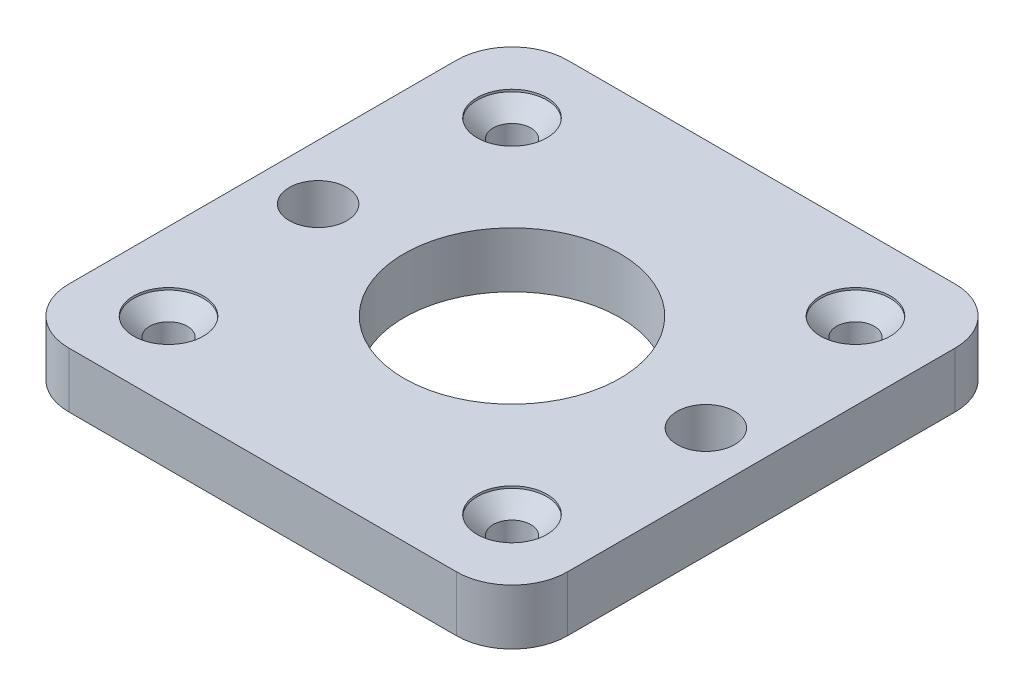
ISO-10303-21;
HEADER;
FILE_DESCRIPTION(('STEP AP214'),'2;1');
FILE_NAME('part.step','',(''),(''),'','','');
FILE_SCHEMA(('AUTOMOTIVE_DESIGN { 1 0 10303 214 1 1 1 1 }'));
ENDSEC;
DATA;
#1=APPLICATION_CONTEXT('core data for automotive mechanical design processes');
#2=APPLICATION_PROTOCOL_DEFINITION('international standard','automotive_design',2000,#1);
#3=PRODUCT_CONTEXT('',#1,'mechanical');
#4=PRODUCT('Part','Part','',(#3));
#5=PRODUCT_RELATED_PRODUCT_CATEGORY('part','',(#4));
#6=PRODUCT_DEFINITION_FORMATION('','',#4);
#7=PRODUCT_DEFINITION_CONTEXT('part definition',#1,'design');
#8=PRODUCT_DEFINITION('design','',#6,#7);
#9=PRODUCT_DEFINITION_SHAPE('','',#8);
#10=(LENGTH_UNIT() NAMED_UNIT(*) SI_UNIT(.MILLI.,.METRE.));
#11=(NAMED_UNIT(*) PLANE_ANGLE_UNIT() SI_UNIT($,.RADIAN.));
#12=(NAMED_UNIT(*) SI_UNIT($,.STERADIAN.) SOLID_ANGLE_UNIT());
#13=UNCERTAINTY_MEASURE_WITH_UNIT(LENGTH_MEASURE(1.E-05),#10,'distance_accuracy_value','');
#14=(GEOMETRIC_REPRESENTATION_CONTEXT(3) GLOBAL_UNCERTAINTY_ASSIGNED_CONTEXT((#13)) GLOBAL_UNIT_ASSIGNED_CONTEXT((#10,
#11,#12)) REPRESENTATION_CONTEXT('',''));
#15=CARTESIAN_POINT('',(0.,0.,0.));
#16=DIRECTION('',(0.,0.,1.));
#17=DIRECTION('',(1.,0.,0.));
#18=AXIS2_PLACEMENT_3D('',#15,#16,#17);
#19=CARTESIAN_POINT('',(0.,-2.5,0.));
#20=DIRECTION('',(0.,1.,0.));
#21=DIRECTION('',(0.,0.,1.));
#22=AXIS2_PLACEMENT_3D('',#19,#20,#21);
#23=PLANE('',#22);
#24=CARTESIAN_POINT('',(0.,-2.5,0.));
#25=DIRECTION('',(0.,1.,0.));
#26=DIRECTION('',(0.,0.,1.));
#27=AXIS2_PLACEMENT_3D('',#24,#25,#26);
#28=CIRCLE('',#27,9.75);
#29=CARTESIAN_POINT('',(0.,-2.5,9.75000000000001));
#30=VERTEX_POINT('',#29);
#31=EDGE_CURVE('E133',#30,#30,#28,.T.);
#32=ORIENTED_EDGE('',*,*,#31,.T.);
#33=EDGE_LOOP('',(#32));
#34=FACE_BOUND('',#33,.T.);
#35=DIRECTION('',(0.,0.,-1.));
#36=VECTOR('',#35,1.);
#37=CARTESIAN_POINT('',(22.5,-2.5,-22.5));
#38=LINE('',#37,#36);
#39=CARTESIAN_POINT('',(22.5,-2.5,17.5));
#40=VERTEX_POINT('',#39);
#41=CARTESIAN_POINT('',(22.5,-2.5,-17.5));
#42=VERTEX_POINT('',#41);
#43=EDGE_CURVE('E117',#40,#42,#38,.T.);
#44=ORIENTED_EDGE('',*,*,#43,.F.);
#45=CARTESIAN_POINT('',(17.5,-2.5,17.5));
#46=DIRECTION('',(0.,1.,0.));
#47=DIRECTION('',(0.,0.,1.));
#48=AXIS2_PLACEMENT_3D('',#45,#46,#47);
#49=CIRCLE('',#48,5.);
#50=CARTESIAN_POINT('',(17.5,-2.5,22.5));
#51=VERTEX_POINT('',#50);
#52=EDGE_CURVE('E100',#40,#51,#49,.F.);
#53=ORIENTED_EDGE('',*,*,#52,.T.);
#54=DIRECTION('',(1.,0.,0.));
#55=VECTOR('',#54,1.);
#56=CARTESIAN_POINT('',(-22.5,-2.5,22.5));
#57=LINE('',#56,#55);
#58=CARTESIAN_POINT('',(-17.5,-2.5,22.5));
#59=VERTEX_POINT('',#58);
#60=EDGE_CURVE('E140',#59,#51,#57,.T.);
#61=ORIENTED_EDGE('',*,*,#60,.F.);
#62=CARTESIAN_POINT('',(-17.5,-2.5,17.5));
#63=DIRECTION('',(0.,1.,0.));
#64=DIRECTION('',(0.,0.,1.));
#65=AXIS2_PLACEMENT_3D('',#62,#63,#64);
#66=CIRCLE('',#65,5.);
#67=CARTESIAN_POINT('',(-22.5,-2.5,17.5));
#68=VERTEX_POINT('',#67);
#69=EDGE_CURVE('E111',#59,#68,#66,.F.);
#70=ORIENTED_EDGE('',*,*,#69,.T.);
#71=DIRECTION('',(0.,0.,1.));
#72=VECTOR('',#71,1.);
#73=CARTESIAN_POINT('',(-22.5,-2.5,-22.5));
#74=LINE('',#73,#72);
#75=CARTESIAN_POINT('',(-22.5,-2.5,-17.5));
#76=VERTEX_POINT('',#75);
#77=EDGE_CURVE('E130',#76,#68,#74,.T.);
#78=ORIENTED_EDGE('',*,*,#77,.F.);
#79=CARTESIAN_POINT('',(-17.5,-2.5,-17.5));
#80=DIRECTION('',(0.,1.,0.));
#81=DIRECTION('',(0.,0.,1.));
#82=AXIS2_PLACEMENT_3D('',#79,#80,#81);
#83=CIRCLE('',#82,5.);
#84=CARTESIAN_POINT('',(-17.5,-2.5,-22.5));
#85=VERTEX_POINT('',#84);
#86=EDGE_CURVE('E144',#76,#85,#83,.F.);
#87=ORIENTED_EDGE('',*,*,#86,.T.);
#88=DIRECTION('',(-1.,0.,0.));
#89=VECTOR('',#88,1.);
#90=CARTESIAN_POINT('',(-22.5,-2.5,-22.5));
#91=LINE('',#90,#89);
#92=CARTESIAN_POINT('',(17.5,-2.5,-22.5));
#93=VERTEX_POINT('',#92);
#94=EDGE_CURVE('E126',#93,#85,#91,.T.);
#95=ORIENTED_EDGE('',*,*,#94,.F.);
#96=CARTESIAN_POINT('',(17.5,-2.5,-17.5));
#97=DIRECTION('',(0.,1.,0.));
#98=DIRECTION('',(0.,0.,1.));
#99=AXIS2_PLACEMENT_3D('',#96,#97,#98);
#100=CIRCLE('',#99,5.);
#101=EDGE_CURVE('E121',#93,#42,#100,.F.);
#102=ORIENTED_EDGE('',*,*,#101,.T.);
#103=EDGE_LOOP('',(#44,#53,#61,#70,#78,#87,#95,#102));
#104=FACE_BOUND('',#103,.T.);
#105=CARTESIAN_POINT('',(-15.5,-2.5,15.5000000000002));
#106=DIRECTION('',(0.,1.,0.));
#107=DIRECTION('',(0.,0.,1.));
#108=AXIS2_PLACEMENT_3D('',#105,#106,#107);
#109=CIRCLE('',#108,1.725);
#110=CARTESIAN_POINT('',(-15.5,-2.5,17.2250000000002));
#111=VERTEX_POINT('',#110);
#112=EDGE_CURVE('E194',#111,#111,#109,.T.);
#113=ORIENTED_EDGE('',*,*,#112,.T.);
#114=EDGE_LOOP('',(#113));
#115=FACE_BOUND('',#114,.T.);
#116=CARTESIAN_POINT('',(15.5,-2.5,15.5000000000002));
#117=DIRECTION('',(0.,1.,0.));
#118=DIRECTION('',(0.,0.,1.));
#119=AXIS2_PLACEMENT_3D('',#116,#117,#118);
#120=CIRCLE('',#119,1.725);
#121=CARTESIAN_POINT('',(15.5,-2.5,17.2250000000002));
#122=VERTEX_POINT('',#121);
#123=EDGE_CURVE('E209',#122,#122,#120,.T.);
#124=ORIENTED_EDGE('',*,*,#123,.T.);
#125=EDGE_LOOP('',(#124));
#126=FACE_BOUND('',#125,.T.);
#127=CARTESIAN_POINT('',(15.5,-2.5,-15.5000000000001));
#128=DIRECTION('',(0.,1.,0.));
#129=DIRECTION('',(0.,0.,1.));
#130=AXIS2_PLACEMENT_3D('',#127,#128,#129);
#131=CIRCLE('',#130,1.725);
#132=CARTESIAN_POINT('',(15.5,-2.5,-13.7750000000001));
#133=VERTEX_POINT('',#132);
#134=EDGE_CURVE('E224',#133,#133,#131,.T.);
#135=ORIENTED_EDGE('',*,*,#134,.T.);
#136=EDGE_LOOP('',(#135));
#137=FACE_BOUND('',#136,.T.);
#138=CARTESIAN_POINT('',(-15.5,-2.5,-15.5000000000001));
#139=DIRECTION('',(0.,1.,0.));
#140=DIRECTION('',(0.,0.,1.));
#141=AXIS2_PLACEMENT_3D('',#138,#139,#140);
#142=CIRCLE('',#141,1.725);
#143=CARTESIAN_POINT('',(-15.5,-2.5,-13.7750000000001));
#144=VERTEX_POINT('',#143);
#145=EDGE_CURVE('E239',#144,#144,#142,.T.);
#146=ORIENTED_EDGE('',*,*,#145,.T.);
#147=EDGE_LOOP('',(#146));
#148=FACE_BOUND('',#147,.T.);
#149=CARTESIAN_POINT('',(17.5,-2.5,0.));
#150=DIRECTION('',(0.,-1.,0.));
#151=DIRECTION('',(0.,0.,-1.));
#152=AXIS2_PLACEMENT_3D('',#149,#150,#151);
#153=CIRCLE('',#152,2.59999999999999);
#154=CARTESIAN_POINT('',(17.5,-2.5,-2.59999999999999));
#155=VERTEX_POINT('',#154);
#156=EDGE_CURVE('E245',#155,#155,#153,.T.);
#157=ORIENTED_EDGE('',*,*,#156,.F.);
#158=EDGE_LOOP('',(#157));
#159=FACE_BOUND('',#158,.T.);
#160=CARTESIAN_POINT('',(-17.5,-2.5,0.));
#161=DIRECTION('',(0.,-1.,0.));
#162=DIRECTION('',(0.,0.,-1.));
#163=AXIS2_PLACEMENT_3D('',#160,#161,#162);
#164=CIRCLE('',#163,2.59999999999999);
#165=CARTESIAN_POINT('',(-17.5,-2.5,-2.59999999999999));
#166=VERTEX_POINT('',#165);
#167=EDGE_CURVE('E251',#166,#166,#164,.T.);
#168=ORIENTED_EDGE('',*,*,#167,.F.);
#169=EDGE_LOOP('',(#168));
#170=FACE_BOUND('',#169,.T.);
#171=ADVANCED_FACE('F34',(#34,#104,#115,#126,#137,#148,#159,#170),#23,.F.);
#172=CARTESIAN_POINT('',(0.,2.5,0.));
#173=DIRECTION('',(0.,1.,0.));
#174=DIRECTION('',(0.,0.,1.));
#175=AXIS2_PLACEMENT_3D('',#172,#173,#174);
#176=PLANE('',#175);
#177=CARTESIAN_POINT('',(-17.5,2.5,0.));
#178=DIRECTION('',(0.,1.,0.));
#179=DIRECTION('',(0.,0.,1.));
#180=AXIS2_PLACEMENT_3D('',#177,#178,#179);
#181=CIRCLE('',#180,2.59999999999999);
#182=CARTESIAN_POINT('',(-17.5,2.5,2.59999999999999));
#183=VERTEX_POINT('',#182);
#184=EDGE_CURVE('E248',#183,#183,#181,.T.);
#185=ORIENTED_EDGE('',*,*,#184,.F.);
#186=EDGE_LOOP('',(#185));
#187=FACE_BOUND('',#186,.T.);
#188=CARTESIAN_POINT('',(17.5,2.5,0.));
#189=DIRECTION('',(0.,1.,0.));
#190=DIRECTION('',(0.,0.,1.));
#191=AXIS2_PLACEMENT_3D('',#188,#189,#190);
#192=CIRCLE('',#191,2.59999999999999);
#193=CARTESIAN_POINT('',(17.5,2.5,2.6));
#194=VERTEX_POINT('',#193);
#195=EDGE_CURVE('E242',#194,#194,#192,.T.);
#196=ORIENTED_EDGE('',*,*,#195,.F.);
#197=EDGE_LOOP('',(#196));
#198=FACE_BOUND('',#197,.T.);
#199=CARTESIAN_POINT('',(-15.5,2.5,-15.5000000000001));
#200=DIRECTION('',(0.,1.,0.));
#201=DIRECTION('',(0.,0.,1.));
#202=AXIS2_PLACEMENT_3D('',#199,#200,#201);
#203=CIRCLE('',#202,3.15);
#204=CARTESIAN_POINT('',(-15.5,2.5,-12.3500000000001));
#205=VERTEX_POINT('',#204);
#206=EDGE_CURVE('E236',#205,#205,#203,.T.);
#207=ORIENTED_EDGE('',*,*,#206,.F.);
#208=EDGE_LOOP('',(#207));
#209=FACE_BOUND('',#208,.T.);
#210=CARTESIAN_POINT('',(15.5,2.5,-15.5000000000001));
#211=DIRECTION('',(0.,1.,0.));
#212=DIRECTION('',(0.,0.,1.));
#213=AXIS2_PLACEMENT_3D('',#210,#211,#212);
#214=CIRCLE('',#213,3.15);
#215=CARTESIAN_POINT('',(15.5,2.5,-12.3500000000001));
#216=VERTEX_POINT('',#215);
#217=EDGE_CURVE('E221',#216,#216,#214,.T.);
#218=ORIENTED_EDGE('',*,*,#217,.F.);
#219=EDGE_LOOP('',(#218));
#220=FACE_BOUND('',#219,.T.);
#221=CARTESIAN_POINT('',(15.5,2.5,15.5000000000002));
#222=DIRECTION('',(0.,1.,0.));
#223=DIRECTION('',(0.,0.,1.));
#224=AXIS2_PLACEMENT_3D('',#221,#222,#223);
#225=CIRCLE('',#224,3.15);
#226=CARTESIAN_POINT('',(15.5,2.5,18.6500000000002));
#227=VERTEX_POINT('',#226);
#228=EDGE_CURVE('E206',#227,#227,#225,.T.);
#229=ORIENTED_EDGE('',*,*,#228,.F.);
#230=EDGE_LOOP('',(#229));
#231=FACE_BOUND('',#230,.T.);
#232=CARTESIAN_POINT('',(-15.5,2.5,15.5000000000002));
#233=DIRECTION('',(0.,1.,0.));
#234=DIRECTION('',(0.,0.,1.));
#235=AXIS2_PLACEMENT_3D('',#232,#233,#234);
#236=CIRCLE('',#235,3.15);
#237=CARTESIAN_POINT('',(-15.5,2.5,18.6500000000002));
#238=VERTEX_POINT('',#237);
#239=EDGE_CURVE('E191',#238,#238,#236,.T.);
#240=ORIENTED_EDGE('',*,*,#239,.F.);
#241=EDGE_LOOP('',(#240));
#242=FACE_BOUND('',#241,.T.);
#243=DIRECTION('',(1.,0.,0.));
#244=VECTOR('',#243,1.);
#245=CARTESIAN_POINT('',(-22.5,2.5,22.5));
#246=LINE('',#245,#244);
#247=CARTESIAN_POINT('',(-17.5,2.5,22.5));
#248=VERTEX_POINT('',#247);
#249=CARTESIAN_POINT('',(17.5,2.5,22.5));
#250=VERTEX_POINT('',#249);
#251=EDGE_CURVE('E136',#248,#250,#246,.T.);
#252=ORIENTED_EDGE('',*,*,#251,.T.);
#253=CARTESIAN_POINT('',(17.5,2.5,17.5));
#254=DIRECTION('',(0.,1.,0.));
#255=DIRECTION('',(0.,0.,1.));
#256=AXIS2_PLACEMENT_3D('',#253,#254,#255);
#257=CIRCLE('',#256,5.);
#258=CARTESIAN_POINT('',(22.5,2.5,17.5));
#259=VERTEX_POINT('',#258);
#260=EDGE_CURVE('E155',#250,#259,#257,.T.);
#261=ORIENTED_EDGE('',*,*,#260,.T.);
#262=DIRECTION('',(0.,0.,-1.));
#263=VECTOR('',#262,1.);
#264=CARTESIAN_POINT('',(22.5,2.5,-22.5));
#265=LINE('',#264,#263);
#266=CARTESIAN_POINT('',(22.5,2.5,-17.5));
#267=VERTEX_POINT('',#266);
#268=EDGE_CURVE('E120',#259,#267,#265,.T.);
#269=ORIENTED_EDGE('',*,*,#268,.T.);
#270=CARTESIAN_POINT('',(17.5,2.5,-17.5));
#271=DIRECTION('',(0.,1.,0.));
#272=DIRECTION('',(0.,0.,1.));
#273=AXIS2_PLACEMENT_3D('',#270,#271,#272);
#274=CIRCLE('',#273,5.);
#275=CARTESIAN_POINT('',(17.5,2.5,-22.5));
#276=VERTEX_POINT('',#275);
#277=EDGE_CURVE('E150',#267,#276,#274,.T.);
#278=ORIENTED_EDGE('',*,*,#277,.T.);
#279=DIRECTION('',(-1.,0.,0.));
#280=VECTOR('',#279,1.);
#281=CARTESIAN_POINT('',(-22.5,2.5,-22.5));
#282=LINE('',#281,#280);
#283=CARTESIAN_POINT('',(-17.5,2.5,-22.5));
#284=VERTEX_POINT('',#283);
#285=EDGE_CURVE('E166',#276,#284,#282,.T.);
#286=ORIENTED_EDGE('',*,*,#285,.T.);
#287=CARTESIAN_POINT('',(-17.5,2.5,-17.5));
#288=DIRECTION('',(0.,1.,0.));
#289=DIRECTION('',(0.,0.,1.));
#290=AXIS2_PLACEMENT_3D('',#287,#288,#289);
#291=CIRCLE('',#290,5.);
#292=CARTESIAN_POINT('',(-22.5,2.5,-17.5));
#293=VERTEX_POINT('',#292);
#294=EDGE_CURVE('E56',#284,#293,#291,.T.);
#295=ORIENTED_EDGE('',*,*,#294,.T.);
#296=DIRECTION('',(0.,0.,1.));
#297=VECTOR('',#296,1.);
#298=CARTESIAN_POINT('',(-22.5,2.5,-22.5));
#299=LINE('',#298,#297);
#300=CARTESIAN_POINT('',(-22.5,2.5,17.5));
#301=VERTEX_POINT('',#300);
#302=EDGE_CURVE('E174',#293,#301,#299,.T.);
#303=ORIENTED_EDGE('',*,*,#302,.T.);
#304=CARTESIAN_POINT('',(-17.5,2.5,17.5));
#305=DIRECTION('',(0.,1.,0.));
#306=DIRECTION('',(0.,0.,1.));
#307=AXIS2_PLACEMENT_3D('',#304,#305,#306);
#308=CIRCLE('',#307,5.);
#309=EDGE_CURVE('E153',#301,#248,#308,.T.);
#310=ORIENTED_EDGE('',*,*,#309,.T.);
#311=EDGE_LOOP('',(#252,#261,#269,#278,#286,#295,#303,#310));
#312=FACE_BOUND('',#311,.T.);
#313=CARTESIAN_POINT('',(0.,2.5,0.));
#314=DIRECTION('',(0.,1.,0.));
#315=DIRECTION('',(0.,0.,1.));
#316=AXIS2_PLACEMENT_3D('',#313,#314,#315);
#317=CIRCLE('',#316,9.75);
#318=CARTESIAN_POINT('',(0.,2.5,9.75000000000001));
#319=VERTEX_POINT('',#318);
#320=EDGE_CURVE('E127',#319,#319,#317,.T.);
#321=ORIENTED_EDGE('',*,*,#320,.F.);
#322=EDGE_LOOP('',(#321));
#323=FACE_BOUND('',#322,.T.);
#324=ADVANCED_FACE('F258',(#187,#198,#209,#220,#231,#242,#312,#323),#176,.T.);
#325=CARTESIAN_POINT('',(22.5,2.5,-22.5));
#326=DIRECTION('',(-1.,0.,0.));
#327=DIRECTION('',(0.,0.,1.));
#328=AXIS2_PLACEMENT_3D('',#325,#326,#327);
#329=PLANE('',#328);
#330=ORIENTED_EDGE('',*,*,#268,.F.);
#331=DIRECTION('',(0.,-1.,0.));
#332=VECTOR('',#331,1.);
#333=CARTESIAN_POINT('',(22.5,2.5,17.5));
#334=LINE('',#333,#332);
#335=EDGE_CURVE('E104',#259,#40,#334,.T.);
#336=ORIENTED_EDGE('',*,*,#335,.T.);
#337=ORIENTED_EDGE('',*,*,#43,.T.);
#338=DIRECTION('',(0.,-1.,0.));
#339=VECTOR('',#338,1.);
#340=CARTESIAN_POINT('',(22.5,2.5,-17.5));
#341=LINE('',#340,#339);
#342=EDGE_CURVE('E122',#42,#267,#341,.F.);
#343=ORIENTED_EDGE('',*,*,#342,.T.);
#344=EDGE_LOOP('',(#330,#336,#337,#343));
#345=FACE_BOUND('',#344,.T.);
#346=ADVANCED_FACE('F116',(#345),#329,.F.);
#347=CARTESIAN_POINT('',(-22.5,2.5,-22.5));
#348=DIRECTION('',(0.,0.,1.));
#349=DIRECTION('',(1.,0.,0.));
#350=AXIS2_PLACEMENT_3D('',#347,#348,#349);
#351=PLANE('',#350);
#352=ORIENTED_EDGE('',*,*,#94,.T.);
#353=DIRECTION('',(0.,-1.,0.));
#354=VECTOR('',#353,1.);
#355=CARTESIAN_POINT('',(-17.5,2.5,-22.5));
#356=LINE('',#355,#354);
#357=EDGE_CURVE('E11',#85,#284,#356,.F.);
#358=ORIENTED_EDGE('',*,*,#357,.T.);
#359=ORIENTED_EDGE('',*,*,#285,.F.);
#360=DIRECTION('',(0.,-1.,0.));
#361=VECTOR('',#360,1.);
#362=CARTESIAN_POINT('',(17.5,2.5,-22.5));
#363=LINE('',#362,#361);
#364=EDGE_CURVE('E42',#276,#93,#363,.T.);
#365=ORIENTED_EDGE('',*,*,#364,.T.);
#366=EDGE_LOOP('',(#352,#358,#359,#365));
#367=FACE_BOUND('',#366,.T.);
#368=ADVANCED_FACE('F164',(#367),#351,.F.);
#369=CARTESIAN_POINT('',(-22.5,2.5,-22.5));
#370=DIRECTION('',(1.,0.,0.));
#371=DIRECTION('',(0.,0.,-1.));
#372=AXIS2_PLACEMENT_3D('',#369,#370,#371);
#373=PLANE('',#372);
#374=ORIENTED_EDGE('',*,*,#77,.T.);
#375=DIRECTION('',(0.,-1.,0.));
#376=VECTOR('',#375,1.);
#377=CARTESIAN_POINT('',(-22.5,2.5,17.5));
#378=LINE('',#377,#376);
#379=EDGE_CURVE('E49',#68,#301,#378,.F.);
#380=ORIENTED_EDGE('',*,*,#379,.T.);
#381=ORIENTED_EDGE('',*,*,#302,.F.);
#382=DIRECTION('',(0.,-1.,0.));
#383=VECTOR('',#382,1.);
#384=CARTESIAN_POINT('',(-22.5,2.5,-17.5));
#385=LINE('',#384,#383);
#386=EDGE_CURVE('E157',#293,#76,#385,.T.);
#387=ORIENTED_EDGE('',*,*,#386,.T.);
#388=EDGE_LOOP('',(#374,#380,#381,#387));
#389=FACE_BOUND('',#388,.T.);
#390=ADVANCED_FACE('F173',(#389),#373,.F.);
#391=CARTESIAN_POINT('',(-22.5,2.5,22.5));
#392=DIRECTION('',(0.,0.,-1.));
#393=DIRECTION('',(-1.,0.,0.));
#394=AXIS2_PLACEMENT_3D('',#391,#392,#393);
#395=PLANE('',#394);
#396=ORIENTED_EDGE('',*,*,#60,.T.);
#397=DIRECTION('',(0.,-1.,0.));
#398=VECTOR('',#397,1.);
#399=CARTESIAN_POINT('',(17.5,2.5,22.5));
#400=LINE('',#399,#398);
#401=EDGE_CURVE('E105',#51,#250,#400,.F.);
#402=ORIENTED_EDGE('',*,*,#401,.T.);
#403=ORIENTED_EDGE('',*,*,#251,.F.);
#404=DIRECTION('',(0.,-1.,0.));
#405=VECTOR('',#404,1.);
#406=CARTESIAN_POINT('',(-17.5,2.5,22.5));
#407=LINE('',#406,#405);
#408=EDGE_CURVE('E110',#248,#59,#407,.T.);
#409=ORIENTED_EDGE('',*,*,#408,.T.);
#410=EDGE_LOOP('',(#396,#402,#403,#409));
#411=FACE_BOUND('',#410,.T.);
#412=ADVANCED_FACE('F268',(#411),#395,.F.);
#413=CARTESIAN_POINT('',(0.,2.5,0.));
#414=DIRECTION('',(0.,-1.,0.));
#415=DIRECTION('',(0.,0.,-1.));
#416=AXIS2_PLACEMENT_3D('',#413,#414,#415);
#417=CYLINDRICAL_SURFACE('',#416,9.75);
#418=ORIENTED_EDGE('',*,*,#320,.T.);
#419=EDGE_LOOP('',(#418));
#420=FACE_BOUND('',#419,.T.);
#421=ORIENTED_EDGE('',*,*,#31,.F.);
#422=EDGE_LOOP('',(#421));
#423=FACE_BOUND('',#422,.T.);
#424=ADVANCED_FACE('F271',(#420,#423),#417,.F.);
#425=CARTESIAN_POINT('',(-15.5,-2.475,15.5000000000002));
#426=DIRECTION('',(0.,-1.,0.));
#427=DIRECTION('',(0.,0.,-1.));
#428=AXIS2_PLACEMENT_3D('',#425,#426,#427);
#429=CONICAL_SURFACE('',#428,1.7,0.785398163397448);
#430=ORIENTED_EDGE('',*,*,#112,.F.);
#431=EDGE_LOOP('',(#430));
#432=FACE_BOUND('',#431,.T.);
#433=CARTESIAN_POINT('',(-15.5,-2.475,15.5000000000002));
#434=DIRECTION('',(0.,1.,0.));
#435=DIRECTION('',(0.,0.,1.));
#436=AXIS2_PLACEMENT_3D('',#433,#434,#435);
#437=CIRCLE('',#436,1.7);
#438=CARTESIAN_POINT('',(-15.5,-2.475,17.2000000000002));
#439=VERTEX_POINT('',#438);
#440=EDGE_CURVE('E181',#439,#439,#437,.T.);
#441=ORIENTED_EDGE('',*,*,#440,.T.);
#442=EDGE_LOOP('',(#441));
#443=FACE_BOUND('',#442,.T.);
#444=ADVANCED_FACE('F302',(#432,#443),#429,.F.);
#445=CARTESIAN_POINT('',(-15.5,2.5,15.5000000000002));
#446=DIRECTION('',(0.,1.,0.));
#447=DIRECTION('',(0.,0.,1.));
#448=AXIS2_PLACEMENT_3D('',#445,#446,#447);
#449=CYLINDRICAL_SURFACE('',#448,1.7);
#450=ORIENTED_EDGE('',*,*,#440,.F.);
#451=EDGE_LOOP('',(#450));
#452=FACE_BOUND('',#451,.T.);
#453=CARTESIAN_POINT('',(-15.5,0.85,15.5000000000002));
#454=DIRECTION('',(0.,1.,0.));
#455=DIRECTION('',(0.,0.,1.));
#456=AXIS2_PLACEMENT_3D('',#453,#454,#455);
#457=CIRCLE('',#456,1.7);
#458=CARTESIAN_POINT('',(-15.5,0.85,17.2000000000002));
#459=VERTEX_POINT('',#458);
#460=EDGE_CURVE('E185',#459,#459,#457,.T.);
#461=ORIENTED_EDGE('',*,*,#460,.T.);
#462=EDGE_LOOP('',(#461));
#463=FACE_BOUND('',#462,.T.);
#464=ADVANCED_FACE('F307',(#452,#463),#449,.F.);
#465=CARTESIAN_POINT('',(-15.5,2.3,15.5000000000002));
#466=DIRECTION('',(0.,1.,0.));
#467=DIRECTION('',(0.,0.,1.));
#468=AXIS2_PLACEMENT_3D('',#465,#466,#467);
#469=CONICAL_SURFACE('',#468,3.15,0.785398163397448);
#470=ORIENTED_EDGE('',*,*,#460,.F.);
#471=EDGE_LOOP('',(#470));
#472=FACE_BOUND('',#471,.T.);
#473=CARTESIAN_POINT('',(-15.5,2.3,15.5000000000002));
#474=DIRECTION('',(0.,1.,0.));
#475=DIRECTION('',(0.,0.,1.));
#476=AXIS2_PLACEMENT_3D('',#473,#474,#475);
#477=CIRCLE('',#476,3.15);
#478=CARTESIAN_POINT('',(-15.5,2.3,18.6500000000002));
#479=VERTEX_POINT('',#478);
#480=EDGE_CURVE('E188',#479,#479,#477,.T.);
#481=ORIENTED_EDGE('',*,*,#480,.T.);
#482=EDGE_LOOP('',(#481));
#483=FACE_BOUND('',#482,.T.);
#484=ADVANCED_FACE('F313',(#472,#483),#469,.F.);
#485=CARTESIAN_POINT('',(-15.5,2.5,15.5000000000002));
#486=DIRECTION('',(0.,1.,0.));
#487=DIRECTION('',(0.,0.,1.));
#488=AXIS2_PLACEMENT_3D('',#485,#486,#487);
#489=CYLINDRICAL_SURFACE('',#488,3.15);
#490=ORIENTED_EDGE('',*,*,#480,.F.);
#491=EDGE_LOOP('',(#490));
#492=FACE_BOUND('',#491,.T.);
#493=ORIENTED_EDGE('',*,*,#239,.T.);
#494=EDGE_LOOP('',(#493));
#495=FACE_BOUND('',#494,.T.);
#496=ADVANCED_FACE('F317',(#492,#495),#489,.F.);
#497=CARTESIAN_POINT('',(15.5,-2.475,15.5000000000002));
#498=DIRECTION('',(0.,-1.,0.));
#499=DIRECTION('',(0.,0.,-1.));
#500=AXIS2_PLACEMENT_3D('',#497,#498,#499);
#501=CONICAL_SURFACE('',#500,1.7,0.785398163397379);
#502=ORIENTED_EDGE('',*,*,#123,.F.);
#503=EDGE_LOOP('',(#502));
#504=FACE_BOUND('',#503,.T.);
#505=CARTESIAN_POINT('',(15.5,-2.475,15.5000000000002));
#506=DIRECTION('',(0.,1.,0.));
#507=DIRECTION('',(0.,0.,1.));
#508=AXIS2_PLACEMENT_3D('',#505,#506,#507);
#509=CIRCLE('',#508,1.7);
#510=CARTESIAN_POINT('',(15.5,-2.475,17.2000000000002));
#511=VERTEX_POINT('',#510);
#512=EDGE_CURVE('E197',#511,#511,#509,.T.);
#513=ORIENTED_EDGE('',*,*,#512,.T.);
#514=EDGE_LOOP('',(#513));
#515=FACE_BOUND('',#514,.T.);
#516=ADVANCED_FACE('F321',(#504,#515),#501,.F.);
#517=CARTESIAN_POINT('',(15.5,2.5,15.5000000000002));
#518=DIRECTION('',(0.,1.,0.));
#519=DIRECTION('',(0.,0.,1.));
#520=AXIS2_PLACEMENT_3D('',#517,#518,#519);
#521=CYLINDRICAL_SURFACE('',#520,1.7);
#522=ORIENTED_EDGE('',*,*,#512,.F.);
#523=EDGE_LOOP('',(#522));
#524=FACE_BOUND('',#523,.T.);
#525=CARTESIAN_POINT('',(15.5,0.85,15.5000000000002));
#526=DIRECTION('',(0.,1.,0.));
#527=DIRECTION('',(0.,0.,1.));
#528=AXIS2_PLACEMENT_3D('',#525,#526,#527);
#529=CIRCLE('',#528,1.7);
#530=CARTESIAN_POINT('',(15.5,0.85,17.2000000000002));
#531=VERTEX_POINT('',#530);
#532=EDGE_CURVE('E200',#531,#531,#529,.T.);
#533=ORIENTED_EDGE('',*,*,#532,.T.);
#534=EDGE_LOOP('',(#533));
#535=FACE_BOUND('',#534,.T.);
#536=ADVANCED_FACE('F325',(#524,#535),#521,.F.);
#537=CARTESIAN_POINT('',(15.5,2.3,15.5000000000002));
#538=DIRECTION('',(0.,1.,0.));
#539=DIRECTION('',(0.,0.,1.));
#540=AXIS2_PLACEMENT_3D('',#537,#538,#539);
#541=CONICAL_SURFACE('',#540,3.15,0.785398163397448);
#542=ORIENTED_EDGE('',*,*,#532,.F.);
#543=EDGE_LOOP('',(#542));
#544=FACE_BOUND('',#543,.T.);
#545=CARTESIAN_POINT('',(15.5,2.3,15.5000000000002));
#546=DIRECTION('',(0.,1.,0.));
#547=DIRECTION('',(0.,0.,1.));
#548=AXIS2_PLACEMENT_3D('',#545,#546,#547);
#549=CIRCLE('',#548,3.15);
#550=CARTESIAN_POINT('',(15.5,2.3,18.6500000000002));
#551=VERTEX_POINT('',#550);
#552=EDGE_CURVE('E203',#551,#551,#549,.T.);
#553=ORIENTED_EDGE('',*,*,#552,.T.);
#554=EDGE_LOOP('',(#553));
#555=FACE_BOUND('',#554,.T.);
#556=ADVANCED_FACE('F329',(#544,#555),#541,.F.);
#557=CARTESIAN_POINT('',(15.5,2.5,15.5000000000002));
#558=DIRECTION('',(0.,1.,0.));
#559=DIRECTION('',(0.,0.,1.));
#560=AXIS2_PLACEMENT_3D('',#557,#558,#559);
#561=CYLINDRICAL_SURFACE('',#560,3.15);
#562=ORIENTED_EDGE('',*,*,#552,.F.);
#563=EDGE_LOOP('',(#562));
#564=FACE_BOUND('',#563,.T.);
#565=ORIENTED_EDGE('',*,*,#228,.T.);
#566=EDGE_LOOP('',(#565));
#567=FACE_BOUND('',#566,.T.);
#568=ADVANCED_FACE('F333',(#564,#567),#561,.F.);
#569=CARTESIAN_POINT('',(15.5,-2.475,-15.5000000000001));
#570=DIRECTION('',(0.,-1.,0.));
#571=DIRECTION('',(0.,0.,-1.));
#572=AXIS2_PLACEMENT_3D('',#569,#570,#571);
#573=CONICAL_SURFACE('',#572,1.7,0.785398163397379);
#574=ORIENTED_EDGE('',*,*,#134,.F.);
#575=EDGE_LOOP('',(#574));
#576=FACE_BOUND('',#575,.T.);
#577=CARTESIAN_POINT('',(15.5,-2.475,-15.5000000000001));
#578=DIRECTION('',(0.,1.,0.));
#579=DIRECTION('',(0.,0.,1.));
#580=AXIS2_PLACEMENT_3D('',#577,#578,#579);
#581=CIRCLE('',#580,1.7);
#582=CARTESIAN_POINT('',(15.5,-2.475,-13.8000000000001));
#583=VERTEX_POINT('',#582);
#584=EDGE_CURVE('E212',#583,#583,#581,.T.);
#585=ORIENTED_EDGE('',*,*,#584,.T.);
#586=EDGE_LOOP('',(#585));
#587=FACE_BOUND('',#586,.T.);
#588=ADVANCED_FACE('F337',(#576,#587),#573,.F.);
#589=CARTESIAN_POINT('',(15.5,2.5,-15.5000000000001));
#590=DIRECTION('',(0.,1.,0.));
#591=DIRECTION('',(0.,0.,1.));
#592=AXIS2_PLACEMENT_3D('',#589,#590,#591);
#593=CYLINDRICAL_SURFACE('',#592,1.7);
#594=ORIENTED_EDGE('',*,*,#584,.F.);
#595=EDGE_LOOP('',(#594));
#596=FACE_BOUND('',#595,.T.);
#597=CARTESIAN_POINT('',(15.5,0.85,-15.5000000000001));
#598=DIRECTION('',(0.,1.,0.));
#599=DIRECTION('',(0.,0.,1.));
#600=AXIS2_PLACEMENT_3D('',#597,#598,#599);
#601=CIRCLE('',#600,1.7);
#602=CARTESIAN_POINT('',(15.5,0.85,-13.8000000000001));
#603=VERTEX_POINT('',#602);
#604=EDGE_CURVE('E215',#603,#603,#601,.T.);
#605=ORIENTED_EDGE('',*,*,#604,.T.);
#606=EDGE_LOOP('',(#605));
#607=FACE_BOUND('',#606,.T.);
#608=ADVANCED_FACE('F341',(#596,#607),#593,.F.);
#609=CARTESIAN_POINT('',(15.5,2.3,-15.5000000000001));
#610=DIRECTION('',(0.,1.,0.));
#611=DIRECTION('',(0.,0.,1.));
#612=AXIS2_PLACEMENT_3D('',#609,#610,#611);
#613=CONICAL_SURFACE('',#612,3.15,0.785398163397448);
#614=ORIENTED_EDGE('',*,*,#604,.F.);
#615=EDGE_LOOP('',(#614));
#616=FACE_BOUND('',#615,.T.);
#617=CARTESIAN_POINT('',(15.5,2.3,-15.5000000000001));
#618=DIRECTION('',(0.,1.,0.));
#619=DIRECTION('',(0.,0.,1.));
#620=AXIS2_PLACEMENT_3D('',#617,#618,#619);
#621=CIRCLE('',#620,3.15);
#622=CARTESIAN_POINT('',(15.5,2.3,-12.3500000000001));
#623=VERTEX_POINT('',#622);
#624=EDGE_CURVE('E218',#623,#623,#621,.T.);
#625=ORIENTED_EDGE('',*,*,#624,.T.);
#626=EDGE_LOOP('',(#625));
#627=FACE_BOUND('',#626,.T.);
#628=ADVANCED_FACE('F345',(#616,#627),#613,.F.);
#629=CARTESIAN_POINT('',(15.5,2.5,-15.5000000000001));
#630=DIRECTION('',(0.,1.,0.));
#631=DIRECTION('',(0.,0.,1.));
#632=AXIS2_PLACEMENT_3D('',#629,#630,#631);
#633=CYLINDRICAL_SURFACE('',#632,3.15);
#634=ORIENTED_EDGE('',*,*,#624,.F.);
#635=EDGE_LOOP('',(#634));
#636=FACE_BOUND('',#635,.T.);
#637=ORIENTED_EDGE('',*,*,#217,.T.);
#638=EDGE_LOOP('',(#637));
#639=FACE_BOUND('',#638,.T.);
#640=ADVANCED_FACE('F349',(#636,#639),#633,.F.);
#641=CARTESIAN_POINT('',(-15.5,-2.475,-15.5000000000001));
#642=DIRECTION('',(0.,-1.,0.));
#643=DIRECTION('',(0.,0.,-1.));
#644=AXIS2_PLACEMENT_3D('',#641,#642,#643);
#645=CONICAL_SURFACE('',#644,1.7,0.785398163397448);
#646=ORIENTED_EDGE('',*,*,#145,.F.);
#647=EDGE_LOOP('',(#646));
#648=FACE_BOUND('',#647,.T.);
#649=CARTESIAN_POINT('',(-15.5,-2.475,-15.5000000000001));
#650=DIRECTION('',(0.,1.,0.));
#651=DIRECTION('',(0.,0.,1.));
#652=AXIS2_PLACEMENT_3D('',#649,#650,#651);
#653=CIRCLE('',#652,1.7);
#654=CARTESIAN_POINT('',(-15.5,-2.475,-13.8000000000001));
#655=VERTEX_POINT('',#654);
#656=EDGE_CURVE('E227',#655,#655,#653,.T.);
#657=ORIENTED_EDGE('',*,*,#656,.T.);
#658=EDGE_LOOP('',(#657));
#659=FACE_BOUND('',#658,.T.);
#660=ADVANCED_FACE('F353',(#648,#659),#645,.F.);
#661=CARTESIAN_POINT('',(-15.5,2.5,-15.5000000000001));
#662=DIRECTION('',(0.,1.,0.));
#663=DIRECTION('',(0.,0.,1.));
#664=AXIS2_PLACEMENT_3D('',#661,#662,#663);
#665=CYLINDRICAL_SURFACE('',#664,1.7);
#666=ORIENTED_EDGE('',*,*,#656,.F.);
#667=EDGE_LOOP('',(#666));
#668=FACE_BOUND('',#667,.T.);
#669=CARTESIAN_POINT('',(-15.5,0.85,-15.5000000000001));
#670=DIRECTION('',(0.,1.,0.));
#671=DIRECTION('',(0.,0.,1.));
#672=AXIS2_PLACEMENT_3D('',#669,#670,#671);
#673=CIRCLE('',#672,1.7);
#674=CARTESIAN_POINT('',(-15.5,0.85,-13.8000000000001));
#675=VERTEX_POINT('',#674);
#676=EDGE_CURVE('E230',#675,#675,#673,.T.);
#677=ORIENTED_EDGE('',*,*,#676,.T.);
#678=EDGE_LOOP('',(#677));
#679=FACE_BOUND('',#678,.T.);
#680=ADVANCED_FACE('F357',(#668,#679),#665,.F.);
#681=CARTESIAN_POINT('',(-15.5,2.3,-15.5000000000001));
#682=DIRECTION('',(0.,1.,0.));
#683=DIRECTION('',(0.,0.,1.));
#684=AXIS2_PLACEMENT_3D('',#681,#682,#683);
#685=CONICAL_SURFACE('',#684,3.15,0.785398163397448);
#686=ORIENTED_EDGE('',*,*,#676,.F.);
#687=EDGE_LOOP('',(#686));
#688=FACE_BOUND('',#687,.T.);
#689=CARTESIAN_POINT('',(-15.5,2.3,-15.5000000000001));
#690=DIRECTION('',(0.,1.,0.));
#691=DIRECTION('',(0.,0.,1.));
#692=AXIS2_PLACEMENT_3D('',#689,#690,#691);
#693=CIRCLE('',#692,3.15);
#694=CARTESIAN_POINT('',(-15.5,2.3,-12.3500000000001));
#695=VERTEX_POINT('',#694);
#696=EDGE_CURVE('E233',#695,#695,#693,.T.);
#697=ORIENTED_EDGE('',*,*,#696,.T.);
#698=EDGE_LOOP('',(#697));
#699=FACE_BOUND('',#698,.T.);
#700=ADVANCED_FACE('F361',(#688,#699),#685,.F.);
#701=CARTESIAN_POINT('',(-15.5,2.5,-15.5000000000001));
#702=DIRECTION('',(0.,1.,0.));
#703=DIRECTION('',(0.,0.,1.));
#704=AXIS2_PLACEMENT_3D('',#701,#702,#703);
#705=CYLINDRICAL_SURFACE('',#704,3.15);
#706=ORIENTED_EDGE('',*,*,#696,.F.);
#707=EDGE_LOOP('',(#706));
#708=FACE_BOUND('',#707,.T.);
#709=ORIENTED_EDGE('',*,*,#206,.T.);
#710=EDGE_LOOP('',(#709));
#711=FACE_BOUND('',#710,.T.);
#712=ADVANCED_FACE('F282',(#708,#711),#705,.F.);
#713=CARTESIAN_POINT('',(17.5,2.5,17.5));
#714=DIRECTION('',(0.,-1.,0.));
#715=DIRECTION('',(0.,0.,-1.));
#716=AXIS2_PLACEMENT_3D('',#713,#714,#715);
#717=CYLINDRICAL_SURFACE('',#716,5.);
#718=ORIENTED_EDGE('',*,*,#260,.F.);
#719=ORIENTED_EDGE('',*,*,#401,.F.);
#720=ORIENTED_EDGE('',*,*,#52,.F.);
#721=ORIENTED_EDGE('',*,*,#335,.F.);
#722=EDGE_LOOP('',(#718,#719,#720,#721));
#723=FACE_BOUND('',#722,.T.);
#724=ADVANCED_FACE('F103',(#723),#717,.T.);
#725=CARTESIAN_POINT('',(-17.5,2.5,17.5));
#726=DIRECTION('',(0.,-1.,0.));
#727=DIRECTION('',(0.,0.,-1.));
#728=AXIS2_PLACEMENT_3D('',#725,#726,#727);
#729=CYLINDRICAL_SURFACE('',#728,5.);
#730=ORIENTED_EDGE('',*,*,#309,.F.);
#731=ORIENTED_EDGE('',*,*,#379,.F.);
#732=ORIENTED_EDGE('',*,*,#69,.F.);
#733=ORIENTED_EDGE('',*,*,#408,.F.);
#734=EDGE_LOOP('',(#730,#731,#732,#733));
#735=FACE_BOUND('',#734,.T.);
#736=ADVANCED_FACE('F281',(#735),#729,.T.);
#737=CARTESIAN_POINT('',(-17.5,2.5,-17.5));
#738=DIRECTION('',(0.,-1.,0.));
#739=DIRECTION('',(0.,0.,-1.));
#740=AXIS2_PLACEMENT_3D('',#737,#738,#739);
#741=CYLINDRICAL_SURFACE('',#740,5.);
#742=ORIENTED_EDGE('',*,*,#294,.F.);
#743=ORIENTED_EDGE('',*,*,#357,.F.);
#744=ORIENTED_EDGE('',*,*,#86,.F.);
#745=ORIENTED_EDGE('',*,*,#386,.F.);
#746=EDGE_LOOP('',(#742,#743,#744,#745));
#747=FACE_BOUND('',#746,.T.);
#748=ADVANCED_FACE('F172',(#747),#741,.T.);
#749=CARTESIAN_POINT('',(17.5,2.5,-17.5));
#750=DIRECTION('',(0.,-1.,0.));
#751=DIRECTION('',(0.,0.,-1.));
#752=AXIS2_PLACEMENT_3D('',#749,#750,#751);
#753=CYLINDRICAL_SURFACE('',#752,5.);
#754=ORIENTED_EDGE('',*,*,#277,.F.);
#755=ORIENTED_EDGE('',*,*,#342,.F.);
#756=ORIENTED_EDGE('',*,*,#101,.F.);
#757=ORIENTED_EDGE('',*,*,#364,.F.);
#758=EDGE_LOOP('',(#754,#755,#756,#757));
#759=FACE_BOUND('',#758,.T.);
#760=ADVANCED_FACE('F36',(#759),#753,.T.);
#761=CARTESIAN_POINT('',(17.5,-2.5,0.));
#762=DIRECTION('',(0.,-1.,0.));
#763=DIRECTION('',(0.,0.,-1.));
#764=AXIS2_PLACEMENT_3D('',#761,#762,#763);
#765=CYLINDRICAL_SURFACE('',#764,2.59999999999999);
#766=ORIENTED_EDGE('',*,*,#195,.T.);
#767=EDGE_LOOP('',(#766));
#768=FACE_BOUND('',#767,.T.);
#769=ORIENTED_EDGE('',*,*,#156,.T.);
#770=EDGE_LOOP('',(#769));
#771=FACE_BOUND('',#770,.T.);
#772=ADVANCED_FACE('F289',(#768,#771),#765,.F.);
#773=CARTESIAN_POINT('',(-17.5,-2.5,0.));
#774=DIRECTION('',(0.,-1.,0.));
#775=DIRECTION('',(0.,0.,-1.));
#776=AXIS2_PLACEMENT_3D('',#773,#774,#775);
#777=CYLINDRICAL_SURFACE('',#776,2.59999999999999);
#778=ORIENTED_EDGE('',*,*,#184,.T.);
#779=EDGE_LOOP('',(#778));
#780=FACE_BOUND('',#779,.T.);
#781=ORIENTED_EDGE('',*,*,#167,.T.);
#782=EDGE_LOOP('',(#781));
#783=FACE_BOUND('',#782,.T.);
#784=ADVANCED_FACE('F255',(#780,#783),#777,.F.);
#785=CLOSED_SHELL('',(#171,#324,#346,#368,#390,#412,#424,#444,#464,#484,#496,#516,#536,#556,
#568,#588,#608,#628,#640,#660,#680,#700,#712,#724,#736,#748,#760,#772,#784));
#786=MANIFOLD_SOLID_BREP('B2',#785);
#787=ADVANCED_BREP_SHAPE_REPRESENTATION('',(#18,#786),#14);
#788=SHAPE_DEFINITION_REPRESENTATION(#9,#787);
ENDSEC;
END-ISO-10303-21;
